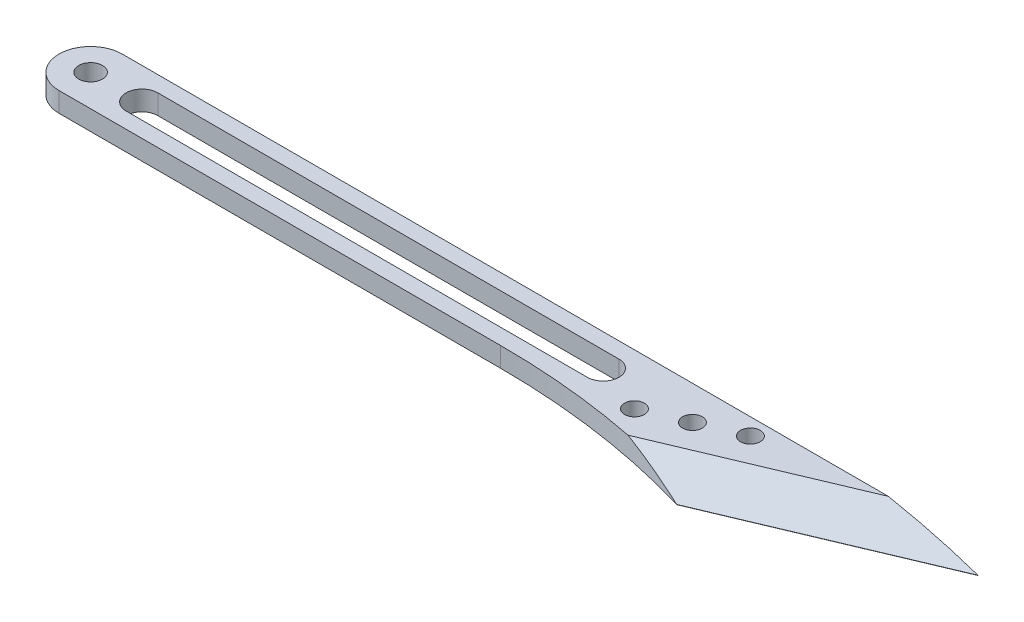
ISO-10303-21;
HEADER;
FILE_DESCRIPTION(('STEP AP214'),'2;1');
FILE_NAME('part.step','',(''),(''),'','','');
FILE_SCHEMA(('AUTOMOTIVE_DESIGN { 1 0 10303 214 1 1 1 1 }'));
ENDSEC;
DATA;
#1=APPLICATION_CONTEXT('core data for automotive mechanical design processes');
#2=APPLICATION_PROTOCOL_DEFINITION('international standard','automotive_design',2000,#1);
#3=PRODUCT_CONTEXT('',#1,'mechanical');
#4=PRODUCT('Part','Part','',(#3));
#5=PRODUCT_RELATED_PRODUCT_CATEGORY('part','',(#4));
#6=PRODUCT_DEFINITION_FORMATION('','',#4);
#7=PRODUCT_DEFINITION_CONTEXT('part definition',#1,'design');
#8=PRODUCT_DEFINITION('design','',#6,#7);
#9=PRODUCT_DEFINITION_SHAPE('','',#8);
#10=(LENGTH_UNIT() NAMED_UNIT(*) SI_UNIT(.MILLI.,.METRE.));
#11=(NAMED_UNIT(*) PLANE_ANGLE_UNIT() SI_UNIT($,.RADIAN.));
#12=(NAMED_UNIT(*) SI_UNIT($,.STERADIAN.) SOLID_ANGLE_UNIT());
#13=UNCERTAINTY_MEASURE_WITH_UNIT(LENGTH_MEASURE(1.E-05),#10,'distance_accuracy_value','');
#14=(GEOMETRIC_REPRESENTATION_CONTEXT(3) GLOBAL_UNCERTAINTY_ASSIGNED_CONTEXT((#13)) GLOBAL_UNIT_ASSIGNED_CONTEXT((#10,
#11,#12)) REPRESENTATION_CONTEXT('',''));
#15=CARTESIAN_POINT('',(0.,0.,0.));
#16=DIRECTION('',(0.,0.,1.));
#17=DIRECTION('',(1.,0.,0.));
#18=AXIS2_PLACEMENT_3D('',#15,#16,#17);
#19=CARTESIAN_POINT('',(104.14,3.175,9.906));
#20=DIRECTION('',(-0.388351244431637,0.,-0.921511427464901));
#21=DIRECTION('',(-0.921511427464901,0.,0.388351244431637));
#22=AXIS2_PLACEMENT_3D('',#19,#20,#21);
#23=PLANE('',#22);
#24=DIRECTION('',(0.,-1.,0.));
#25=VECTOR('',#24,1.);
#26=CARTESIAN_POINT('',(138.193220338983,185.160186643893,-4.445));
#27=LINE('',#26,#25);
#28=CARTESIAN_POINT('',(138.193220338983,0.032723590692979,-4.445));
#29=VERTEX_POINT('',#28);
#30=CARTESIAN_POINT('',(138.193220338983,0.,-4.44500000000002));
#31=VERTEX_POINT('',#30);
#32=EDGE_CURVE('E134',#29,#31,#27,.T.);
#33=ORIENTED_EDGE('',*,*,#32,.F.);
#34=DIRECTION('',(0.921511427464901,0.,-0.388351244431637));
#35=VECTOR('',#34,1.);
#36=CARTESIAN_POINT('',(104.14,0.0327235906929127,9.906));
#37=LINE('',#36,#35);
#38=CARTESIAN_POINT('',(104.14,0.0327235906929127,9.906));
#39=VERTEX_POINT('',#38);
#40=EDGE_CURVE('E122',#39,#29,#37,.T.);
#41=ORIENTED_EDGE('',*,*,#40,.F.);
#42=DIRECTION('',(0.,-1.,0.));
#43=VECTOR('',#42,1.);
#44=CARTESIAN_POINT('',(104.14,3.175,9.906));
#45=LINE('',#44,#43);
#46=CARTESIAN_POINT('',(104.14,0.,9.906));
#47=VERTEX_POINT('',#46);
#48=EDGE_CURVE('E224',#39,#47,#45,.T.);
#49=ORIENTED_EDGE('',*,*,#48,.T.);
#50=DIRECTION('',(0.921511427464901,0.,-0.388351244431637));
#51=VECTOR('',#50,1.);
#52=CARTESIAN_POINT('',(104.14,0.,9.906));
#53=LINE('',#52,#51);
#54=EDGE_CURVE('E135',#47,#31,#53,.T.);
#55=ORIENTED_EDGE('',*,*,#54,.T.);
#56=EDGE_LOOP('',(#33,#41,#49,#55));
#57=FACE_BOUND('',#56,.T.);
#58=ADVANCED_FACE('F41',(#57),#23,.F.);
#59=CARTESIAN_POINT('',(0.,0.,0.));
#60=DIRECTION('',(0.,1.,0.));
#61=DIRECTION('',(0.,0.,1.));
#62=AXIS2_PLACEMENT_3D('',#59,#60,#61);
#63=PLANE('',#62);
#64=CARTESIAN_POINT('',(0.,0.,0.));
#65=DIRECTION('',(0.,1.,0.));
#66=DIRECTION('',(0.,0.,1.));
#67=AXIS2_PLACEMENT_3D('',#64,#65,#66);
#68=CIRCLE('',#67,1.905);
#69=CARTESIAN_POINT('',(0.,0.,1.905));
#70=VERTEX_POINT('',#69);
#71=EDGE_CURVE('E197',#70,#70,#68,.F.);
#72=ORIENTED_EDGE('',*,*,#71,.F.);
#73=EDGE_LOOP('',(#72));
#74=FACE_BOUND('',#73,.T.);
#75=DIRECTION('',(-1.,0.,0.));
#76=VECTOR('',#75,1.);
#77=CARTESIAN_POINT('',(82.3822224165396,0.,2.54));
#78=LINE('',#77,#76);
#79=CARTESIAN_POINT('',(82.3822224165396,0.,2.54));
#80=VERTEX_POINT('',#79);
#81=CARTESIAN_POINT('',(8.255,0.,2.54000000000001));
#82=VERTEX_POINT('',#81);
#83=EDGE_CURVE('E162',#80,#82,#78,.T.);
#84=ORIENTED_EDGE('',*,*,#83,.F.);
#85=CARTESIAN_POINT('',(82.3822224165395,0.,0.));
#86=DIRECTION('',(0.,1.,0.));
#87=DIRECTION('',(0.,0.,1.));
#88=AXIS2_PLACEMENT_3D('',#85,#86,#87);
#89=CIRCLE('',#88,2.54);
#90=CARTESIAN_POINT('',(82.3822224165396,0.,-2.54));
#91=VERTEX_POINT('',#90);
#92=EDGE_CURVE('E165',#91,#80,#89,.F.);
#93=ORIENTED_EDGE('',*,*,#92,.F.);
#94=DIRECTION('',(1.,0.,0.));
#95=VECTOR('',#94,1.);
#96=CARTESIAN_POINT('',(82.3822224165396,0.,-2.54));
#97=LINE('',#96,#95);
#98=CARTESIAN_POINT('',(8.255,0.,-2.53999999999999));
#99=VERTEX_POINT('',#98);
#100=EDGE_CURVE('E182',#99,#91,#97,.T.);
#101=ORIENTED_EDGE('',*,*,#100,.F.);
#102=CARTESIAN_POINT('',(8.255,0.,0.));
#103=DIRECTION('',(0.,1.,0.));
#104=DIRECTION('',(0.,0.,1.));
#105=AXIS2_PLACEMENT_3D('',#102,#103,#104);
#106=CIRCLE('',#105,2.54);
#107=EDGE_CURVE('E160',#82,#99,#106,.F.);
#108=ORIENTED_EDGE('',*,*,#107,.F.);
#109=EDGE_LOOP('',(#84,#93,#101,#108));
#110=FACE_BOUND('',#109,.T.);
#111=CARTESIAN_POINT('',(97.1115214901258,0.,0.375932152653003));
#112=DIRECTION('',(0.,1.,0.));
#113=DIRECTION('',(0.,0.,1.));
#114=AXIS2_PLACEMENT_3D('',#111,#112,#113);
#115=CIRCLE('',#114,1.5875);
#116=CARTESIAN_POINT('',(97.1115214901258,0.,1.963432152653));
#117=VERTEX_POINT('',#116);
#118=EDGE_CURVE('E157',#117,#117,#115,.F.);
#119=ORIENTED_EDGE('',*,*,#118,.F.);
#120=EDGE_LOOP('',(#119));
#121=FACE_BOUND('',#120,.T.);
#122=CARTESIAN_POINT('',(103.665310762256,0.,-2.38602189774481));
#123=DIRECTION('',(0.,1.,0.));
#124=DIRECTION('',(0.,0.,1.));
#125=AXIS2_PLACEMENT_3D('',#122,#123,#124);
#126=CIRCLE('',#125,1.5875);
#127=CARTESIAN_POINT('',(103.665310762256,0.,-0.798521897744816));
#128=VERTEX_POINT('',#127);
#129=EDGE_CURVE('E151',#128,#128,#126,.F.);
#130=ORIENTED_EDGE('',*,*,#129,.F.);
#131=EDGE_LOOP('',(#130));
#132=FACE_BOUND('',#131,.T.);
#133=CARTESIAN_POINT('',(90.5577322179954,0.,3.1378862030508));
#134=DIRECTION('',(0.,1.,0.));
#135=DIRECTION('',(0.,0.,1.));
#136=AXIS2_PLACEMENT_3D('',#133,#134,#135);
#137=CIRCLE('',#136,1.5875);
#138=CARTESIAN_POINT('',(90.5577322179954,0.,4.7253862030508));
#139=VERTEX_POINT('',#138);
#140=EDGE_CURVE('E145',#139,#139,#137,.F.);
#141=ORIENTED_EDGE('',*,*,#140,.F.);
#142=EDGE_LOOP('',(#141));
#143=FACE_BOUND('',#142,.T.);
#144=CARTESIAN_POINT('',(123.13874290649,0.,173.692059657824));
#145=DIRECTION('',(0.,1.,0.));
#146=DIRECTION('',(0.,0.,1.));
#147=AXIS2_PLACEMENT_3D('',#144,#145,#146);
#148=CIRCLE('',#147,178.772059657824);
#149=CARTESIAN_POINT('',(123.13874290649,0.,-5.08));
#150=VERTEX_POINT('',#149);
#151=EDGE_CURVE('E56',#31,#150,#148,.T.);
#152=ORIENTED_EDGE('',*,*,#151,.F.);
#153=ORIENTED_EDGE('',*,*,#54,.F.);
#154=CARTESIAN_POINT('',(70.9475085398513,0.,121.639445227107));
#155=DIRECTION('',(0.,-1.,0.));
#156=DIRECTION('',(0.,0.,-1.));
#157=AXIS2_PLACEMENT_3D('',#154,#155,#156);
#158=CIRCLE('',#157,116.559445227107);
#159=CARTESIAN_POINT('',(70.9475085398513,0.,5.08));
#160=VERTEX_POINT('',#159);
#161=EDGE_CURVE('E217',#160,#47,#158,.T.);
#162=ORIENTED_EDGE('',*,*,#161,.F.);
#163=DIRECTION('',(1.,0.,0.));
#164=VECTOR('',#163,1.);
#165=CARTESIAN_POINT('',(0.,0.,5.08));
#166=LINE('',#165,#164);
#167=CARTESIAN_POINT('',(0.,0.,5.08));
#168=VERTEX_POINT('',#167);
#169=EDGE_CURVE('E215',#168,#160,#166,.T.);
#170=ORIENTED_EDGE('',*,*,#169,.F.);
#171=CARTESIAN_POINT('',(0.,0.,0.));
#172=DIRECTION('',(0.,1.,0.));
#173=DIRECTION('',(0.,0.,1.));
#174=AXIS2_PLACEMENT_3D('',#171,#172,#173);
#175=CIRCLE('',#174,5.08);
#176=CARTESIAN_POINT('',(0.,0.,-5.08));
#177=VERTEX_POINT('',#176);
#178=EDGE_CURVE('E200',#177,#168,#175,.T.);
#179=ORIENTED_EDGE('',*,*,#178,.F.);
#180=DIRECTION('',(-1.,0.,0.));
#181=VECTOR('',#180,1.);
#182=CARTESIAN_POINT('',(0.,0.,-5.08));
#183=LINE('',#182,#181);
#184=EDGE_CURVE('E205',#150,#177,#183,.T.);
#185=ORIENTED_EDGE('',*,*,#184,.F.);
#186=EDGE_LOOP('',(#152,#153,#162,#170,#179,#185));
#187=FACE_BOUND('',#186,.T.);
#188=ADVANCED_FACE('F237',(#74,#110,#121,#132,#143,#187),#63,.F.);
#189=CARTESIAN_POINT('',(101.642286038625,3.175,3.97922110860055));
#190=DIRECTION('',(-0.170477859299862,-0.898497550455397,-0.404523733931876));
#191=DIRECTION('',(0.,0.410533323106093,-0.91184559582172));
#192=AXIS2_PLACEMENT_3D('',#189,#190,#191);
#193=PLANE('',#192);
#194=CARTESIAN_POINT('',(123.13874290649,-77.312187815728,173.692059657824));
#195=DIRECTION('',(-0.170477859299862,-0.898497550455397,-0.404523733931876));
#196=DIRECTION('',(0.348932641838131,-0.438978532306138,0.82797576029387));
#197=AXIS2_PLACEMENT_3D('',#194,#195,#196);
#198=ELLIPSE('',#197,198.967776336413,178.772059657824);
#199=CARTESIAN_POINT('',(123.13874290649,3.175,-5.08));
#200=VERTEX_POINT('',#199);
#201=EDGE_CURVE('E13',#200,#29,#198,.T.);
#202=ORIENTED_EDGE('',*,*,#201,.F.);
#203=DIRECTION('',(0.921511427464901,0.,-0.388351244431637));
#204=VECTOR('',#203,1.);
#205=CARTESIAN_POINT('',(101.642286038625,3.175,3.97922110860055));
#206=LINE('',#205,#204);
#207=CARTESIAN_POINT('',(93.7066225385513,3.175,7.3235364407743));
#208=VERTEX_POINT('',#207);
#209=EDGE_CURVE('E131',#208,#200,#206,.T.);
#210=ORIENTED_EDGE('',*,*,#209,.F.);
#211=CARTESIAN_POINT('',(70.9475085398513,-43.9743475018731,121.639445227107));
#212=DIRECTION('',(0.170477859299862,0.898497550455398,0.404523733931876));
#213=DIRECTION('',(0.348932641838131,-0.438978532306137,0.82797576029387));
#214=AXIS2_PLACEMENT_3D('',#211,#212,#213);
#215=ELLIPSE('',#214,129.727059542934,116.559445227107);
#216=EDGE_CURVE('E127',#39,#208,#215,.T.);
#217=ORIENTED_EDGE('',*,*,#216,.F.);
#218=ORIENTED_EDGE('',*,*,#40,.T.);
#219=EDGE_LOOP('',(#202,#210,#217,#218));
#220=FACE_BOUND('',#219,.T.);
#221=ADVANCED_FACE('F124',(#220),#193,.F.);
#222=CARTESIAN_POINT('',(70.9475085398513,3.175,121.639445227107));
#223=DIRECTION('',(0.,-1.,0.));
#224=DIRECTION('',(0.,0.,-1.));
#225=AXIS2_PLACEMENT_3D('',#222,#223,#224);
#226=CYLINDRICAL_SURFACE('',#225,116.559445227107);
#227=ORIENTED_EDGE('',*,*,#216,.T.);
#228=CARTESIAN_POINT('',(70.9475085398513,3.175,121.639445227107));
#229=DIRECTION('',(0.,-1.,0.));
#230=DIRECTION('',(0.,0.,-1.));
#231=AXIS2_PLACEMENT_3D('',#228,#229,#230);
#232=CIRCLE('',#231,116.559445227107);
#233=CARTESIAN_POINT('',(70.9475085398513,3.175,5.08));
#234=VERTEX_POINT('',#233);
#235=EDGE_CURVE('E207',#234,#208,#232,.T.);
#236=ORIENTED_EDGE('',*,*,#235,.F.);
#237=DIRECTION('',(0.,-1.,0.));
#238=VECTOR('',#237,1.);
#239=CARTESIAN_POINT('',(70.9475085398513,3.175,5.08));
#240=LINE('',#239,#238);
#241=EDGE_CURVE('E226',#234,#160,#240,.T.);
#242=ORIENTED_EDGE('',*,*,#241,.T.);
#243=ORIENTED_EDGE('',*,*,#161,.T.);
#244=ORIENTED_EDGE('',*,*,#48,.F.);
#245=EDGE_LOOP('',(#227,#236,#242,#243,#244));
#246=FACE_BOUND('',#245,.T.);
#247=ADVANCED_FACE('F240',(#246),#226,.F.);
#248=CARTESIAN_POINT('',(0.,3.175,0.));
#249=DIRECTION('',(0.,1.,0.));
#250=DIRECTION('',(0.,0.,1.));
#251=AXIS2_PLACEMENT_3D('',#248,#249,#250);
#252=PLANE('',#251);
#253=CARTESIAN_POINT('',(90.5577322179954,3.175,3.1378862030508));
#254=DIRECTION('',(0.,1.,0.));
#255=DIRECTION('',(0.,0.,1.));
#256=AXIS2_PLACEMENT_3D('',#253,#254,#255);
#257=CIRCLE('',#256,1.5875);
#258=CARTESIAN_POINT('',(90.5577322179954,3.175,4.7253862030508));
#259=VERTEX_POINT('',#258);
#260=EDGE_CURVE('E142',#259,#259,#257,.T.);
#261=ORIENTED_EDGE('',*,*,#260,.F.);
#262=EDGE_LOOP('',(#261));
#263=FACE_BOUND('',#262,.T.);
#264=CARTESIAN_POINT('',(103.665310762256,3.175,-2.38602189774481));
#265=DIRECTION('',(0.,1.,0.));
#266=DIRECTION('',(0.,0.,1.));
#267=AXIS2_PLACEMENT_3D('',#264,#265,#266);
#268=CIRCLE('',#267,1.5875);
#269=CARTESIAN_POINT('',(103.665310762256,3.175,-0.798521897744816));
#270=VERTEX_POINT('',#269);
#271=EDGE_CURVE('E148',#270,#270,#268,.T.);
#272=ORIENTED_EDGE('',*,*,#271,.F.);
#273=EDGE_LOOP('',(#272));
#274=FACE_BOUND('',#273,.T.);
#275=CARTESIAN_POINT('',(97.1115214901258,3.175,0.375932152653003));
#276=DIRECTION('',(0.,1.,0.));
#277=DIRECTION('',(0.,0.,1.));
#278=AXIS2_PLACEMENT_3D('',#275,#276,#277);
#279=CIRCLE('',#278,1.5875);
#280=CARTESIAN_POINT('',(97.1115214901258,3.175,1.963432152653));
#281=VERTEX_POINT('',#280);
#282=EDGE_CURVE('E154',#281,#281,#279,.T.);
#283=ORIENTED_EDGE('',*,*,#282,.F.);
#284=EDGE_LOOP('',(#283));
#285=FACE_BOUND('',#284,.T.);
#286=CARTESIAN_POINT('',(82.3822224165395,3.175,0.));
#287=DIRECTION('',(0.,1.,0.));
#288=DIRECTION('',(0.,0.,1.));
#289=AXIS2_PLACEMENT_3D('',#286,#287,#288);
#290=CIRCLE('',#289,2.54);
#291=CARTESIAN_POINT('',(82.3822224165396,3.175,2.54));
#292=VERTEX_POINT('',#291);
#293=CARTESIAN_POINT('',(82.3822224165396,3.175,-2.54));
#294=VERTEX_POINT('',#293);
#295=EDGE_CURVE('E168',#292,#294,#290,.T.);
#296=ORIENTED_EDGE('',*,*,#295,.F.);
#297=DIRECTION('',(1.,0.,0.));
#298=VECTOR('',#297,1.);
#299=CARTESIAN_POINT('',(82.3822224165396,3.175,2.54));
#300=LINE('',#299,#298);
#301=CARTESIAN_POINT('',(8.255,3.175,2.54000000000001));
#302=VERTEX_POINT('',#301);
#303=EDGE_CURVE('E176',#302,#292,#300,.T.);
#304=ORIENTED_EDGE('',*,*,#303,.F.);
#305=CARTESIAN_POINT('',(8.255,3.175,0.));
#306=DIRECTION('',(0.,1.,0.));
#307=DIRECTION('',(0.,0.,1.));
#308=AXIS2_PLACEMENT_3D('',#305,#306,#307);
#309=CIRCLE('',#308,2.54);
#310=CARTESIAN_POINT('',(8.255,3.175,-2.54));
#311=VERTEX_POINT('',#310);
#312=EDGE_CURVE('E173',#311,#302,#309,.T.);
#313=ORIENTED_EDGE('',*,*,#312,.F.);
#314=DIRECTION('',(-1.,0.,0.));
#315=VECTOR('',#314,1.);
#316=CARTESIAN_POINT('',(82.3822224165396,3.175,-2.54));
#317=LINE('',#316,#315);
#318=EDGE_CURVE('E170',#294,#311,#317,.T.);
#319=ORIENTED_EDGE('',*,*,#318,.F.);
#320=EDGE_LOOP('',(#296,#304,#313,#319));
#321=FACE_BOUND('',#320,.T.);
#322=CARTESIAN_POINT('',(0.,3.175,0.));
#323=DIRECTION('',(0.,1.,0.));
#324=DIRECTION('',(0.,0.,1.));
#325=AXIS2_PLACEMENT_3D('',#322,#323,#324);
#326=CIRCLE('',#325,1.905);
#327=CARTESIAN_POINT('',(0.,3.175,1.905));
#328=VERTEX_POINT('',#327);
#329=EDGE_CURVE('E130',#328,#328,#326,.T.);
#330=ORIENTED_EDGE('',*,*,#329,.F.);
#331=EDGE_LOOP('',(#330));
#332=FACE_BOUND('',#331,.T.);
#333=ORIENTED_EDGE('',*,*,#235,.T.);
#334=ORIENTED_EDGE('',*,*,#209,.T.);
#335=DIRECTION('',(-1.,0.,0.));
#336=VECTOR('',#335,1.);
#337=CARTESIAN_POINT('',(0.,3.175,-5.08));
#338=LINE('',#337,#336);
#339=CARTESIAN_POINT('',(0.,3.175,-5.08));
#340=VERTEX_POINT('',#339);
#341=EDGE_CURVE('E210',#200,#340,#338,.T.);
#342=ORIENTED_EDGE('',*,*,#341,.T.);
#343=CARTESIAN_POINT('',(0.,3.175,0.));
#344=DIRECTION('',(0.,1.,0.));
#345=DIRECTION('',(0.,0.,1.));
#346=AXIS2_PLACEMENT_3D('',#343,#344,#345);
#347=CIRCLE('',#346,5.08);
#348=CARTESIAN_POINT('',(0.,3.175,5.08));
#349=VERTEX_POINT('',#348);
#350=EDGE_CURVE('E201',#340,#349,#347,.T.);
#351=ORIENTED_EDGE('',*,*,#350,.T.);
#352=DIRECTION('',(1.,0.,0.));
#353=VECTOR('',#352,1.);
#354=CARTESIAN_POINT('',(0.,3.175,5.08));
#355=LINE('',#354,#353);
#356=EDGE_CURVE('E204',#349,#234,#355,.T.);
#357=ORIENTED_EDGE('',*,*,#356,.T.);
#358=EDGE_LOOP('',(#333,#334,#342,#351,#357));
#359=FACE_BOUND('',#358,.T.);
#360=ADVANCED_FACE('F243',(#263,#274,#285,#321,#332,#359),#252,.T.);
#361=CARTESIAN_POINT('',(0.,3.175,0.));
#362=DIRECTION('',(0.,-1.,0.));
#363=DIRECTION('',(0.,0.,-1.));
#364=AXIS2_PLACEMENT_3D('',#361,#362,#363);
#365=CYLINDRICAL_SURFACE('',#364,5.08);
#366=ORIENTED_EDGE('',*,*,#178,.T.);
#367=DIRECTION('',(0.,-1.,0.));
#368=VECTOR('',#367,1.);
#369=CARTESIAN_POINT('',(0.,3.175,5.08));
#370=LINE('',#369,#368);
#371=EDGE_CURVE('E49',#349,#168,#370,.T.);
#372=ORIENTED_EDGE('',*,*,#371,.F.);
#373=ORIENTED_EDGE('',*,*,#350,.F.);
#374=DIRECTION('',(0.,-1.,0.));
#375=VECTOR('',#374,1.);
#376=CARTESIAN_POINT('',(0.,3.175,-5.08));
#377=LINE('',#376,#375);
#378=EDGE_CURVE('E212',#340,#177,#377,.T.);
#379=ORIENTED_EDGE('',*,*,#378,.T.);
#380=EDGE_LOOP('',(#366,#372,#373,#379));
#381=FACE_BOUND('',#380,.T.);
#382=ADVANCED_FACE('F43',(#381),#365,.T.);
#383=CARTESIAN_POINT('',(0.,3.175,5.08));
#384=DIRECTION('',(0.,0.,-1.));
#385=DIRECTION('',(-1.,0.,0.));
#386=AXIS2_PLACEMENT_3D('',#383,#384,#385);
#387=PLANE('',#386);
#388=ORIENTED_EDGE('',*,*,#169,.T.);
#389=ORIENTED_EDGE('',*,*,#241,.F.);
#390=ORIENTED_EDGE('',*,*,#356,.F.);
#391=ORIENTED_EDGE('',*,*,#371,.T.);
#392=EDGE_LOOP('',(#388,#389,#390,#391));
#393=FACE_BOUND('',#392,.T.);
#394=ADVANCED_FACE('F231',(#393),#387,.F.);
#395=CARTESIAN_POINT('',(0.,3.175,-5.08));
#396=DIRECTION('',(0.,0.,1.));
#397=DIRECTION('',(1.,0.,0.));
#398=AXIS2_PLACEMENT_3D('',#395,#396,#397);
#399=PLANE('',#398);
#400=ORIENTED_EDGE('',*,*,#341,.F.);
#401=DIRECTION('',(0.,-1.,0.));
#402=VECTOR('',#401,1.);
#403=CARTESIAN_POINT('',(123.13874290649,185.160186643893,-5.08));
#404=LINE('',#403,#402);
#405=EDGE_CURVE('E64',#200,#150,#404,.T.);
#406=ORIENTED_EDGE('',*,*,#405,.T.);
#407=ORIENTED_EDGE('',*,*,#184,.T.);
#408=ORIENTED_EDGE('',*,*,#378,.F.);
#409=EDGE_LOOP('',(#400,#406,#407,#408));
#410=FACE_BOUND('',#409,.T.);
#411=ADVANCED_FACE('F244',(#410),#399,.F.);
#412=CARTESIAN_POINT('',(0.,-0.00100000000000013,0.));
#413=DIRECTION('',(0.,1.,0.));
#414=DIRECTION('',(0.,0.,1.));
#415=AXIS2_PLACEMENT_3D('',#412,#413,#414);
#416=CYLINDRICAL_SURFACE('',#415,1.905);
#417=ORIENTED_EDGE('',*,*,#329,.T.);
#418=EDGE_LOOP('',(#417));
#419=FACE_BOUND('',#418,.T.);
#420=ORIENTED_EDGE('',*,*,#71,.T.);
#421=EDGE_LOOP('',(#420));
#422=FACE_BOUND('',#421,.T.);
#423=ADVANCED_FACE('F246',(#419,#422),#416,.F.);
#424=CARTESIAN_POINT('',(82.3822224165395,-0.00100000000000013,0.));
#425=DIRECTION('',(0.,1.,0.));
#426=DIRECTION('',(0.,0.,1.));
#427=AXIS2_PLACEMENT_3D('',#424,#425,#426);
#428=CYLINDRICAL_SURFACE('',#427,2.54);
#429=ORIENTED_EDGE('',*,*,#92,.T.);
#430=DIRECTION('',(0.,1.,0.));
#431=VECTOR('',#430,1.);
#432=CARTESIAN_POINT('',(82.3822224165396,-0.00100000000000013,2.54));
#433=LINE('',#432,#431);
#434=EDGE_CURVE('E180',#80,#292,#433,.T.);
#435=ORIENTED_EDGE('',*,*,#434,.T.);
#436=ORIENTED_EDGE('',*,*,#295,.T.);
#437=DIRECTION('',(0.,1.,0.));
#438=VECTOR('',#437,1.);
#439=CARTESIAN_POINT('',(82.3822224165396,-0.00100000000000013,-2.54));
#440=LINE('',#439,#438);
#441=EDGE_CURVE('E179',#91,#294,#440,.T.);
#442=ORIENTED_EDGE('',*,*,#441,.F.);
#443=EDGE_LOOP('',(#429,#435,#436,#442));
#444=FACE_BOUND('',#443,.T.);
#445=ADVANCED_FACE('F253',(#444),#428,.F.);
#446=CARTESIAN_POINT('',(82.3822224165396,-0.00100000000000013,2.54));
#447=DIRECTION('',(0.,0.,1.));
#448=DIRECTION('',(1.,0.,0.));
#449=AXIS2_PLACEMENT_3D('',#446,#447,#448);
#450=PLANE('',#449);
#451=ORIENTED_EDGE('',*,*,#83,.T.);
#452=DIRECTION('',(0.,1.,0.));
#453=VECTOR('',#452,1.);
#454=CARTESIAN_POINT('',(8.255,-0.00100000000000013,2.54000000000001));
#455=LINE('',#454,#453);
#456=EDGE_CURVE('E183',#82,#302,#455,.T.);
#457=ORIENTED_EDGE('',*,*,#456,.T.);
#458=ORIENTED_EDGE('',*,*,#303,.T.);
#459=ORIENTED_EDGE('',*,*,#434,.F.);
#460=EDGE_LOOP('',(#451,#457,#458,#459));
#461=FACE_BOUND('',#460,.T.);
#462=ADVANCED_FACE('F279',(#461),#450,.F.);
#463=CARTESIAN_POINT('',(8.255,-0.00100000000000013,0.));
#464=DIRECTION('',(0.,1.,0.));
#465=DIRECTION('',(0.,0.,1.));
#466=AXIS2_PLACEMENT_3D('',#463,#464,#465);
#467=CYLINDRICAL_SURFACE('',#466,2.54);
#468=ORIENTED_EDGE('',*,*,#107,.T.);
#469=DIRECTION('',(0.,1.,0.));
#470=VECTOR('',#469,1.);
#471=CARTESIAN_POINT('',(8.255,-0.00100000000000013,-2.54));
#472=LINE('',#471,#470);
#473=EDGE_CURVE('E185',#99,#311,#472,.T.);
#474=ORIENTED_EDGE('',*,*,#473,.T.);
#475=ORIENTED_EDGE('',*,*,#312,.T.);
#476=ORIENTED_EDGE('',*,*,#456,.F.);
#477=EDGE_LOOP('',(#468,#474,#475,#476));
#478=FACE_BOUND('',#477,.T.);
#479=ADVANCED_FACE('F285',(#478),#467,.F.);
#480=CARTESIAN_POINT('',(82.3822224165396,-0.00100000000000013,-2.54));
#481=DIRECTION('',(0.,0.,-1.));
#482=DIRECTION('',(-1.,0.,0.));
#483=AXIS2_PLACEMENT_3D('',#480,#481,#482);
#484=PLANE('',#483);
#485=ORIENTED_EDGE('',*,*,#100,.T.);
#486=ORIENTED_EDGE('',*,*,#441,.T.);
#487=ORIENTED_EDGE('',*,*,#318,.T.);
#488=ORIENTED_EDGE('',*,*,#473,.F.);
#489=EDGE_LOOP('',(#485,#486,#487,#488));
#490=FACE_BOUND('',#489,.T.);
#491=ADVANCED_FACE('F281',(#490),#484,.F.);
#492=CARTESIAN_POINT('',(97.1115214901258,-0.00100000000000013,0.375932152653003));
#493=DIRECTION('',(0.,1.,0.));
#494=DIRECTION('',(0.,0.,1.));
#495=AXIS2_PLACEMENT_3D('',#492,#493,#494);
#496=CYLINDRICAL_SURFACE('',#495,1.5875);
#497=ORIENTED_EDGE('',*,*,#282,.T.);
#498=EDGE_LOOP('',(#497));
#499=FACE_BOUND('',#498,.T.);
#500=ORIENTED_EDGE('',*,*,#118,.T.);
#501=EDGE_LOOP('',(#500));
#502=FACE_BOUND('',#501,.T.);
#503=ADVANCED_FACE('F284',(#499,#502),#496,.F.);
#504=CARTESIAN_POINT('',(103.665310762256,-0.00100000000000013,-2.38602189774481));
#505=DIRECTION('',(0.,1.,0.));
#506=DIRECTION('',(0.,0.,1.));
#507=AXIS2_PLACEMENT_3D('',#504,#505,#506);
#508=CYLINDRICAL_SURFACE('',#507,1.5875);
#509=ORIENTED_EDGE('',*,*,#271,.T.);
#510=EDGE_LOOP('',(#509));
#511=FACE_BOUND('',#510,.T.);
#512=ORIENTED_EDGE('',*,*,#129,.T.);
#513=EDGE_LOOP('',(#512));
#514=FACE_BOUND('',#513,.T.);
#515=ADVANCED_FACE('F295',(#511,#514),#508,.F.);
#516=CARTESIAN_POINT('',(90.5577322179954,-0.00100000000000013,3.1378862030508));
#517=DIRECTION('',(0.,1.,0.));
#518=DIRECTION('',(0.,0.,1.));
#519=AXIS2_PLACEMENT_3D('',#516,#517,#518);
#520=CYLINDRICAL_SURFACE('',#519,1.5875);
#521=ORIENTED_EDGE('',*,*,#260,.T.);
#522=EDGE_LOOP('',(#521));
#523=FACE_BOUND('',#522,.T.);
#524=ORIENTED_EDGE('',*,*,#140,.T.);
#525=EDGE_LOOP('',(#524));
#526=FACE_BOUND('',#525,.T.);
#527=ADVANCED_FACE('F299',(#523,#526),#520,.F.);
#528=CARTESIAN_POINT('',(123.13874290649,185.160186643893,173.692059657824));
#529=DIRECTION('',(0.,-1.,0.));
#530=DIRECTION('',(0.,0.,-1.));
#531=AXIS2_PLACEMENT_3D('',#528,#529,#530);
#532=CYLINDRICAL_SURFACE('',#531,178.772059657824);
#533=ORIENTED_EDGE('',*,*,#32,.T.);
#534=ORIENTED_EDGE('',*,*,#151,.T.);
#535=ORIENTED_EDGE('',*,*,#405,.F.);
#536=ORIENTED_EDGE('',*,*,#201,.T.);
#537=EDGE_LOOP('',(#533,#534,#535,#536));
#538=FACE_BOUND('',#537,.T.);
#539=ADVANCED_FACE('F138',(#538),#532,.T.);
#540=CLOSED_SHELL('',(#58,#188,#221,#247,#360,#382,#394,#411,#423,#445,#462,#479,#491,#503,#515,
#527,#539));
#541=MANIFOLD_SOLID_BREP('B2',#540);
#542=ADVANCED_BREP_SHAPE_REPRESENTATION('',(#18,#541),#14);
#543=SHAPE_DEFINITION_REPRESENTATION(#9,#542);
ENDSEC;
END-ISO-10303-21;
